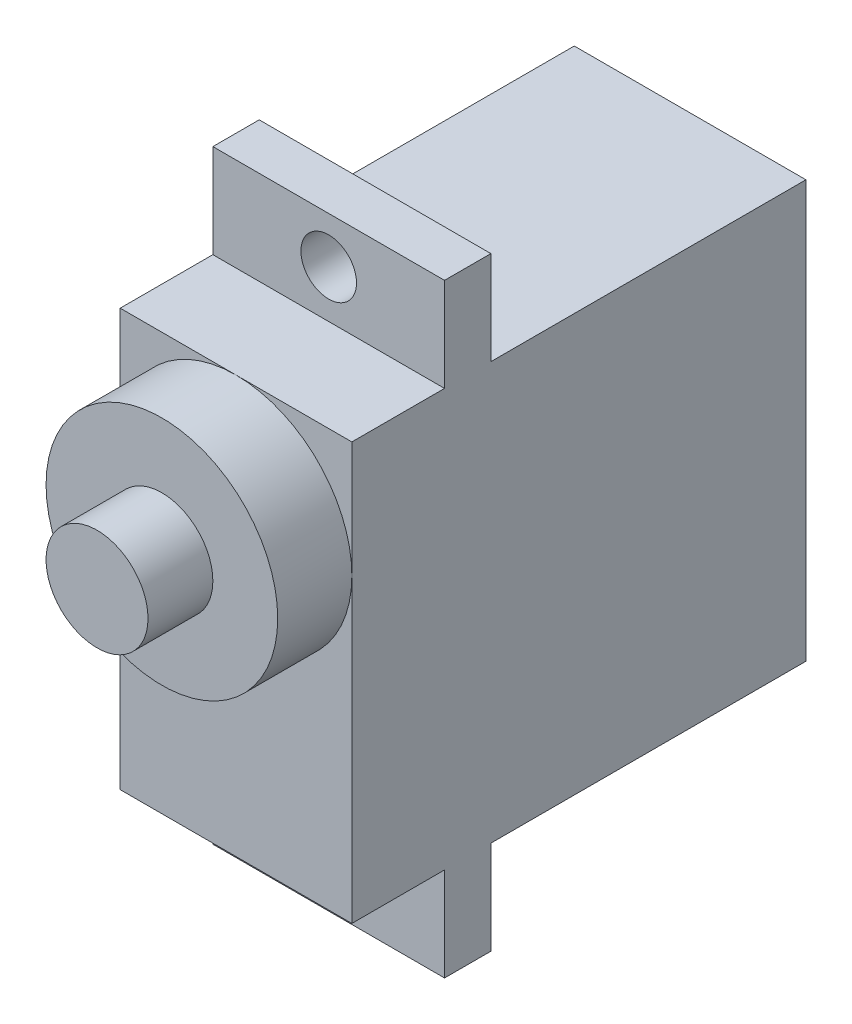
ISO-10303-21;
HEADER;
FILE_DESCRIPTION(('STEP AP214'),'2;1');
FILE_NAME('part.step','',(''),(''),'','','');
FILE_SCHEMA(('AUTOMOTIVE_DESIGN { 1 0 10303 214 1 1 1 1 }'));
ENDSEC;
DATA;
#1=APPLICATION_CONTEXT('core data for automotive mechanical design processes');
#2=APPLICATION_PROTOCOL_DEFINITION('international standard','automotive_design',2000,#1);
#3=PRODUCT_CONTEXT('',#1,'mechanical');
#4=PRODUCT('Part','Part','',(#3));
#5=PRODUCT_RELATED_PRODUCT_CATEGORY('part','',(#4));
#6=PRODUCT_DEFINITION_FORMATION('','',#4);
#7=PRODUCT_DEFINITION_CONTEXT('part definition',#1,'design');
#8=PRODUCT_DEFINITION('design','',#6,#7);
#9=PRODUCT_DEFINITION_SHAPE('','',#8);
#10=(LENGTH_UNIT() NAMED_UNIT(*) SI_UNIT(.MILLI.,.METRE.));
#11=(NAMED_UNIT(*) PLANE_ANGLE_UNIT() SI_UNIT($,.RADIAN.));
#12=(NAMED_UNIT(*) SI_UNIT($,.STERADIAN.) SOLID_ANGLE_UNIT());
#13=UNCERTAINTY_MEASURE_WITH_UNIT(LENGTH_MEASURE(1.E-05),#10,'distance_accuracy_value','');
#14=(GEOMETRIC_REPRESENTATION_CONTEXT(3) GLOBAL_UNCERTAINTY_ASSIGNED_CONTEXT((#13)) GLOBAL_UNIT_ASSIGNED_CONTEXT((#10,
#11,#12)) REPRESENTATION_CONTEXT('',''));
#15=CARTESIAN_POINT('',(0.,0.,0.));
#16=DIRECTION('',(0.,0.,1.));
#17=DIRECTION('',(1.,0.,0.));
#18=AXIS2_PLACEMENT_3D('',#15,#16,#17);
#19=CARTESIAN_POINT('',(0.,0.,24.5));
#20=DIRECTION('',(0.,0.,1.));
#21=DIRECTION('',(1.,0.,0.));
#22=AXIS2_PLACEMENT_3D('',#19,#20,#21);
#23=PLANE('',#22);
#24=DIRECTION('',(0.,1.,0.));
#25=VECTOR('',#24,1.);
#26=CARTESIAN_POINT('',(6.25,0.,24.5));
#27=LINE('',#26,#25);
#28=CARTESIAN_POINT('',(6.25,-11.25,24.5));
#29=VERTEX_POINT('',#28);
#30=CARTESIAN_POINT('',(6.25,5.,24.5));
#31=VERTEX_POINT('',#30);
#32=EDGE_CURVE('E162',#29,#31,#27,.T.);
#33=ORIENTED_EDGE('',*,*,#32,.T.);
#34=CARTESIAN_POINT('',(0.,5.,24.5));
#35=DIRECTION('',(0.,0.,1.));
#36=DIRECTION('',(1.,0.,0.));
#37=AXIS2_PLACEMENT_3D('',#34,#35,#36);
#38=CIRCLE('',#37,6.25);
#39=CARTESIAN_POINT('',(-6.25,5.,24.5));
#40=VERTEX_POINT('',#39);
#41=EDGE_CURVE('E57',#31,#40,#38,.F.);
#42=ORIENTED_EDGE('',*,*,#41,.T.);
#43=DIRECTION('',(0.,1.,0.));
#44=VECTOR('',#43,1.);
#45=CARTESIAN_POINT('',(-6.25,0.,24.5));
#46=LINE('',#45,#44);
#47=CARTESIAN_POINT('',(-6.25,-11.25,24.5));
#48=VERTEX_POINT('',#47);
#49=EDGE_CURVE('E167',#48,#40,#46,.T.);
#50=ORIENTED_EDGE('',*,*,#49,.F.);
#51=DIRECTION('',(1.,0.,0.));
#52=VECTOR('',#51,1.);
#53=CARTESIAN_POINT('',(0.,-11.25,24.5));
#54=LINE('',#53,#52);
#55=EDGE_CURVE('E172',#48,#29,#54,.T.);
#56=ORIENTED_EDGE('',*,*,#55,.T.);
#57=EDGE_LOOP('',(#33,#42,#50,#56));
#58=FACE_BOUND('',#57,.T.);
#59=ADVANCED_FACE('F41',(#58),#23,.T.);
#60=CARTESIAN_POINT('',(-6.25,11.25,24.5));
#61=VERTEX_POINT('',#60);
#62=EDGE_CURVE('E155',#40,#61,#46,.T.);
#63=ORIENTED_EDGE('',*,*,#62,.F.);
#64=CARTESIAN_POINT('',(0.,11.25,24.5));
#65=VERTEX_POINT('',#64);
#66=EDGE_CURVE('E142',#40,#65,#38,.F.);
#67=ORIENTED_EDGE('',*,*,#66,.T.);
#68=DIRECTION('',(1.,0.,0.));
#69=VECTOR('',#68,1.);
#70=CARTESIAN_POINT('',(0.,11.25,24.5));
#71=LINE('',#70,#69);
#72=EDGE_CURVE('E154',#61,#65,#71,.T.);
#73=ORIENTED_EDGE('',*,*,#72,.F.);
#74=EDGE_LOOP('',(#63,#67,#73));
#75=FACE_BOUND('',#74,.T.);
#76=ADVANCED_FACE('F152',(#75),#23,.T.);
#77=CARTESIAN_POINT('',(6.25,0.,24.5));
#78=DIRECTION('',(-1.,0.,0.));
#79=DIRECTION('',(0.,0.,1.));
#80=AXIS2_PLACEMENT_3D('',#77,#78,#79);
#81=PLANE('',#80);
#82=DIRECTION('',(0.,1.,0.));
#83=VECTOR('',#82,1.);
#84=CARTESIAN_POINT('',(6.25,0.,0.));
#85=LINE('',#84,#83);
#86=CARTESIAN_POINT('',(6.25,-11.25,0.));
#87=VERTEX_POINT('',#86);
#88=CARTESIAN_POINT('',(6.25,11.25,0.));
#89=VERTEX_POINT('',#88);
#90=EDGE_CURVE('E175',#87,#89,#85,.T.);
#91=ORIENTED_EDGE('',*,*,#90,.T.);
#92=DIRECTION('',(0.,0.,-1.));
#93=VECTOR('',#92,1.);
#94=CARTESIAN_POINT('',(6.25,11.25,17.));
#95=LINE('',#94,#93);
#96=CARTESIAN_POINT('',(6.25,11.25,17.));
#97=VERTEX_POINT('',#96);
#98=EDGE_CURVE('E210',#97,#89,#95,.T.);
#99=ORIENTED_EDGE('',*,*,#98,.F.);
#100=DIRECTION('',(0.,1.,0.));
#101=VECTOR('',#100,1.);
#102=CARTESIAN_POINT('',(6.25,0.,17.));
#103=LINE('',#102,#101);
#104=CARTESIAN_POINT('',(6.25,16.3,17.));
#105=VERTEX_POINT('',#104);
#106=EDGE_CURVE('E241',#97,#105,#103,.T.);
#107=ORIENTED_EDGE('',*,*,#106,.T.);
#108=DIRECTION('',(0.,0.,-1.));
#109=VECTOR('',#108,1.);
#110=CARTESIAN_POINT('',(6.25,16.3,19.5));
#111=LINE('',#110,#109);
#112=CARTESIAN_POINT('',(6.25,16.3,19.5));
#113=VERTEX_POINT('',#112);
#114=EDGE_CURVE('E178',#113,#105,#111,.T.);
#115=ORIENTED_EDGE('',*,*,#114,.F.);
#116=DIRECTION('',(0.,1.,0.));
#117=VECTOR('',#116,1.);
#118=CARTESIAN_POINT('',(6.25,0.,19.5));
#119=LINE('',#118,#117);
#120=CARTESIAN_POINT('',(6.25,11.25,19.5));
#121=VERTEX_POINT('',#120);
#122=EDGE_CURVE('E200',#121,#113,#119,.T.);
#123=ORIENTED_EDGE('',*,*,#122,.F.);
#124=DIRECTION('',(0.,0.,-1.));
#125=VECTOR('',#124,1.);
#126=CARTESIAN_POINT('',(6.25,11.25,24.5));
#127=LINE('',#126,#125);
#128=CARTESIAN_POINT('',(6.25,11.25,24.5));
#129=VERTEX_POINT('',#128);
#130=EDGE_CURVE('E11',#129,#121,#127,.T.);
#131=ORIENTED_EDGE('',*,*,#130,.F.);
#132=EDGE_CURVE('E159',#31,#129,#27,.T.);
#133=ORIENTED_EDGE('',*,*,#132,.F.);
#134=ORIENTED_EDGE('',*,*,#32,.F.);
#135=DIRECTION('',(0.,0.,-1.));
#136=VECTOR('',#135,1.);
#137=CARTESIAN_POINT('',(6.25,-11.25,24.5));
#138=LINE('',#137,#136);
#139=CARTESIAN_POINT('',(6.25,-11.25,19.5));
#140=VERTEX_POINT('',#139);
#141=EDGE_CURVE('E174',#29,#140,#138,.T.);
#142=ORIENTED_EDGE('',*,*,#141,.T.);
#143=DIRECTION('',(0.,1.,0.));
#144=VECTOR('',#143,1.);
#145=CARTESIAN_POINT('',(6.25,0.,19.5));
#146=LINE('',#145,#144);
#147=CARTESIAN_POINT('',(6.25,-16.3,19.5));
#148=VERTEX_POINT('',#147);
#149=EDGE_CURVE('E209',#148,#140,#146,.T.);
#150=ORIENTED_EDGE('',*,*,#149,.F.);
#151=DIRECTION('',(0.,0.,-1.));
#152=VECTOR('',#151,1.);
#153=CARTESIAN_POINT('',(6.25,-16.3,19.5));
#154=LINE('',#153,#152);
#155=CARTESIAN_POINT('',(6.25,-16.3,17.));
#156=VERTEX_POINT('',#155);
#157=EDGE_CURVE('E223',#148,#156,#154,.T.);
#158=ORIENTED_EDGE('',*,*,#157,.T.);
#159=DIRECTION('',(0.,1.,0.));
#160=VECTOR('',#159,1.);
#161=CARTESIAN_POINT('',(6.25,0.,17.));
#162=LINE('',#161,#160);
#163=CARTESIAN_POINT('',(6.25,-11.25,17.));
#164=VERTEX_POINT('',#163);
#165=EDGE_CURVE('E65',#156,#164,#162,.T.);
#166=ORIENTED_EDGE('',*,*,#165,.T.);
#167=DIRECTION('',(0.,0.,-1.));
#168=VECTOR('',#167,1.);
#169=CARTESIAN_POINT('',(6.25,-11.25,17.));
#170=LINE('',#169,#168);
#171=EDGE_CURVE('E234',#164,#87,#170,.T.);
#172=ORIENTED_EDGE('',*,*,#171,.T.);
#173=EDGE_LOOP('',(#91,#99,#107,#115,#123,#131,#133,#134,#142,#150,#158,#166,#172));
#174=FACE_BOUND('',#173,.T.);
#175=ADVANCED_FACE('F43',(#174),#81,.F.);
#176=CARTESIAN_POINT('',(-6.25,0.,24.5));
#177=DIRECTION('',(-1.,0.,0.));
#178=DIRECTION('',(0.,0.,1.));
#179=AXIS2_PLACEMENT_3D('',#176,#177,#178);
#180=PLANE('',#179);
#181=ORIENTED_EDGE('',*,*,#49,.T.);
#182=ORIENTED_EDGE('',*,*,#62,.T.);
#183=DIRECTION('',(0.,0.,-1.));
#184=VECTOR('',#183,1.);
#185=CARTESIAN_POINT('',(-6.25,11.25,24.5));
#186=LINE('',#185,#184);
#187=CARTESIAN_POINT('',(-6.25,11.25,19.5));
#188=VERTEX_POINT('',#187);
#189=EDGE_CURVE('E50',#61,#188,#186,.T.);
#190=ORIENTED_EDGE('',*,*,#189,.T.);
#191=DIRECTION('',(0.,1.,0.));
#192=VECTOR('',#191,1.);
#193=CARTESIAN_POINT('',(-6.25,0.,19.5));
#194=LINE('',#193,#192);
#195=CARTESIAN_POINT('',(-6.25,16.3,19.5));
#196=VERTEX_POINT('',#195);
#197=EDGE_CURVE('E190',#188,#196,#194,.T.);
#198=ORIENTED_EDGE('',*,*,#197,.T.);
#199=DIRECTION('',(0.,0.,-1.));
#200=VECTOR('',#199,1.);
#201=CARTESIAN_POINT('',(-6.25,16.3,19.5));
#202=LINE('',#201,#200);
#203=CARTESIAN_POINT('',(-6.25,16.3,17.));
#204=VERTEX_POINT('',#203);
#205=EDGE_CURVE('E197',#196,#204,#202,.T.);
#206=ORIENTED_EDGE('',*,*,#205,.T.);
#207=DIRECTION('',(0.,1.,0.));
#208=VECTOR('',#207,1.);
#209=CARTESIAN_POINT('',(-6.25,0.,17.));
#210=LINE('',#209,#208);
#211=CARTESIAN_POINT('',(-6.25,11.25,17.));
#212=VERTEX_POINT('',#211);
#213=EDGE_CURVE('E248',#212,#204,#210,.T.);
#214=ORIENTED_EDGE('',*,*,#213,.F.);
#215=DIRECTION('',(0.,0.,-1.));
#216=VECTOR('',#215,1.);
#217=CARTESIAN_POINT('',(-6.25,11.25,17.));
#218=LINE('',#217,#216);
#219=CARTESIAN_POINT('',(-6.25,11.25,0.));
#220=VERTEX_POINT('',#219);
#221=EDGE_CURVE('E250',#212,#220,#218,.T.);
#222=ORIENTED_EDGE('',*,*,#221,.T.);
#223=DIRECTION('',(0.,1.,0.));
#224=VECTOR('',#223,1.);
#225=CARTESIAN_POINT('',(-6.25,0.,0.));
#226=LINE('',#225,#224);
#227=CARTESIAN_POINT('',(-6.25,-11.25,0.));
#228=VERTEX_POINT('',#227);
#229=EDGE_CURVE('E177',#228,#220,#226,.T.);
#230=ORIENTED_EDGE('',*,*,#229,.F.);
#231=DIRECTION('',(0.,0.,-1.));
#232=VECTOR('',#231,1.);
#233=CARTESIAN_POINT('',(-6.25,-11.25,17.));
#234=LINE('',#233,#232);
#235=CARTESIAN_POINT('',(-6.25,-11.25,17.));
#236=VERTEX_POINT('',#235);
#237=EDGE_CURVE('E276',#236,#228,#234,.T.);
#238=ORIENTED_EDGE('',*,*,#237,.F.);
#239=DIRECTION('',(0.,1.,0.));
#240=VECTOR('',#239,1.);
#241=CARTESIAN_POINT('',(-6.25,0.,17.));
#242=LINE('',#241,#240);
#243=CARTESIAN_POINT('',(-6.25,-16.3,17.));
#244=VERTEX_POINT('',#243);
#245=EDGE_CURVE('E270',#244,#236,#242,.T.);
#246=ORIENTED_EDGE('',*,*,#245,.F.);
#247=DIRECTION('',(0.,0.,-1.));
#248=VECTOR('',#247,1.);
#249=CARTESIAN_POINT('',(-6.25,-16.3,19.5));
#250=LINE('',#249,#248);
#251=CARTESIAN_POINT('',(-6.25,-16.3,19.5));
#252=VERTEX_POINT('',#251);
#253=EDGE_CURVE('E221',#252,#244,#250,.T.);
#254=ORIENTED_EDGE('',*,*,#253,.F.);
#255=DIRECTION('',(0.,1.,0.));
#256=VECTOR('',#255,1.);
#257=CARTESIAN_POINT('',(-6.25,0.,19.5));
#258=LINE('',#257,#256);
#259=CARTESIAN_POINT('',(-6.25,-11.25,19.5));
#260=VERTEX_POINT('',#259);
#261=EDGE_CURVE('E215',#252,#260,#258,.T.);
#262=ORIENTED_EDGE('',*,*,#261,.T.);
#263=DIRECTION('',(0.,0.,-1.));
#264=VECTOR('',#263,1.);
#265=CARTESIAN_POINT('',(-6.25,-11.25,24.5));
#266=LINE('',#265,#264);
#267=EDGE_CURVE('E182',#48,#260,#266,.T.);
#268=ORIENTED_EDGE('',*,*,#267,.F.);
#269=EDGE_LOOP('',(#181,#182,#190,#198,#206,#214,#222,#230,#238,#246,#254,#262,#268));
#270=FACE_BOUND('',#269,.T.);
#271=ADVANCED_FACE('F188',(#270),#180,.T.);
#272=CARTESIAN_POINT('',(0.,0.,0.));
#273=DIRECTION('',(0.,0.,1.));
#274=DIRECTION('',(1.,0.,0.));
#275=AXIS2_PLACEMENT_3D('',#272,#273,#274);
#276=PLANE('',#275);
#277=DIRECTION('',(1.,0.,0.));
#278=VECTOR('',#277,1.);
#279=CARTESIAN_POINT('',(0.,11.25,0.));
#280=LINE('',#279,#278);
#281=EDGE_CURVE('E258',#220,#89,#280,.T.);
#282=ORIENTED_EDGE('',*,*,#281,.T.);
#283=ORIENTED_EDGE('',*,*,#90,.F.);
#284=DIRECTION('',(1.,0.,0.));
#285=VECTOR('',#284,1.);
#286=CARTESIAN_POINT('',(0.,-11.25,0.));
#287=LINE('',#286,#285);
#288=EDGE_CURVE('E266',#228,#87,#287,.T.);
#289=ORIENTED_EDGE('',*,*,#288,.F.);
#290=ORIENTED_EDGE('',*,*,#229,.T.);
#291=EDGE_LOOP('',(#282,#283,#289,#290));
#292=FACE_BOUND('',#291,.T.);
#293=ADVANCED_FACE('F283',(#292),#276,.F.);
#294=CARTESIAN_POINT('',(0.,11.25,24.5));
#295=DIRECTION('',(0.,1.,0.));
#296=DIRECTION('',(0.,0.,1.));
#297=AXIS2_PLACEMENT_3D('',#294,#295,#296);
#298=PLANE('',#297);
#299=ORIENTED_EDGE('',*,*,#72,.T.);
#300=EDGE_CURVE('E157',#65,#129,#71,.T.);
#301=ORIENTED_EDGE('',*,*,#300,.T.);
#302=ORIENTED_EDGE('',*,*,#130,.T.);
#303=DIRECTION('',(1.,0.,0.));
#304=VECTOR('',#303,1.);
#305=CARTESIAN_POINT('',(0.,11.25,19.5));
#306=LINE('',#305,#304);
#307=EDGE_CURVE('E194',#188,#121,#306,.T.);
#308=ORIENTED_EDGE('',*,*,#307,.F.);
#309=ORIENTED_EDGE('',*,*,#189,.F.);
#310=EDGE_LOOP('',(#299,#301,#302,#308,#309));
#311=FACE_BOUND('',#310,.T.);
#312=ADVANCED_FACE('F165',(#311),#298,.T.);
#313=CARTESIAN_POINT('',(0.,-11.25,24.5));
#314=DIRECTION('',(0.,1.,0.));
#315=DIRECTION('',(0.,0.,1.));
#316=AXIS2_PLACEMENT_3D('',#313,#314,#315);
#317=PLANE('',#316);
#318=ORIENTED_EDGE('',*,*,#267,.T.);
#319=DIRECTION('',(1.,0.,0.));
#320=VECTOR('',#319,1.);
#321=CARTESIAN_POINT('',(0.,-11.25,19.5));
#322=LINE('',#321,#320);
#323=EDGE_CURVE('E212',#260,#140,#322,.T.);
#324=ORIENTED_EDGE('',*,*,#323,.T.);
#325=ORIENTED_EDGE('',*,*,#141,.F.);
#326=ORIENTED_EDGE('',*,*,#55,.F.);
#327=EDGE_LOOP('',(#318,#324,#325,#326));
#328=FACE_BOUND('',#327,.T.);
#329=ADVANCED_FACE('F328',(#328),#317,.F.);
#330=ORIENTED_EDGE('',*,*,#300,.F.);
#331=EDGE_CURVE('E138',#65,#31,#38,.F.);
#332=ORIENTED_EDGE('',*,*,#331,.T.);
#333=ORIENTED_EDGE('',*,*,#132,.T.);
#334=EDGE_LOOP('',(#330,#332,#333));
#335=FACE_BOUND('',#334,.T.);
#336=ADVANCED_FACE('F158',(#335),#23,.T.);
#337=CARTESIAN_POINT('',(0.,-16.3,19.5));
#338=DIRECTION('',(0.,1.,0.));
#339=DIRECTION('',(0.,0.,1.));
#340=AXIS2_PLACEMENT_3D('',#337,#338,#339);
#341=PLANE('',#340);
#342=ORIENTED_EDGE('',*,*,#253,.T.);
#343=DIRECTION('',(1.,0.,0.));
#344=VECTOR('',#343,1.);
#345=CARTESIAN_POINT('',(0.,-16.3,17.));
#346=LINE('',#345,#344);
#347=EDGE_CURVE('E264',#244,#156,#346,.T.);
#348=ORIENTED_EDGE('',*,*,#347,.T.);
#349=ORIENTED_EDGE('',*,*,#157,.F.);
#350=DIRECTION('',(1.,0.,0.));
#351=VECTOR('',#350,1.);
#352=CARTESIAN_POINT('',(0.,-16.3,19.5));
#353=LINE('',#352,#351);
#354=EDGE_CURVE('E206',#252,#148,#353,.T.);
#355=ORIENTED_EDGE('',*,*,#354,.F.);
#356=EDGE_LOOP('',(#342,#348,#349,#355));
#357=FACE_BOUND('',#356,.T.);
#358=ADVANCED_FACE('F327',(#357),#341,.F.);
#359=CARTESIAN_POINT('',(0.,-13.8,19.5));
#360=DIRECTION('',(0.,0.,-1.));
#361=DIRECTION('',(-1.,0.,0.));
#362=AXIS2_PLACEMENT_3D('',#359,#360,#361);
#363=CYLINDRICAL_SURFACE('',#362,1.5);
#364=CARTESIAN_POINT('',(0.,-13.8,17.));
#365=DIRECTION('',(0.,0.,1.));
#366=DIRECTION('',(1.,0.,0.));
#367=AXIS2_PLACEMENT_3D('',#364,#365,#366);
#368=CIRCLE('',#367,1.5);
#369=CARTESIAN_POINT('',(1.5,-13.8,17.));
#370=VERTEX_POINT('',#369);
#371=EDGE_CURVE('E273',#370,#370,#368,.F.);
#372=ORIENTED_EDGE('',*,*,#371,.T.);
#373=EDGE_LOOP('',(#372));
#374=FACE_BOUND('',#373,.T.);
#375=CARTESIAN_POINT('',(0.,-13.8,19.5));
#376=DIRECTION('',(0.,0.,1.));
#377=DIRECTION('',(1.,0.,0.));
#378=AXIS2_PLACEMENT_3D('',#375,#376,#377);
#379=CIRCLE('',#378,1.5);
#380=CARTESIAN_POINT('',(1.5,-13.8,19.5));
#381=VERTEX_POINT('',#380);
#382=EDGE_CURVE('E218',#381,#381,#379,.F.);
#383=ORIENTED_EDGE('',*,*,#382,.F.);
#384=EDGE_LOOP('',(#383));
#385=FACE_BOUND('',#384,.T.);
#386=ADVANCED_FACE('F334',(#374,#385),#363,.F.);
#387=CARTESIAN_POINT('',(0.,0.,19.5));
#388=DIRECTION('',(0.,0.,1.));
#389=DIRECTION('',(1.,0.,0.));
#390=AXIS2_PLACEMENT_3D('',#387,#388,#389);
#391=PLANE('',#390);
#392=ORIENTED_EDGE('',*,*,#354,.T.);
#393=ORIENTED_EDGE('',*,*,#149,.T.);
#394=ORIENTED_EDGE('',*,*,#323,.F.);
#395=ORIENTED_EDGE('',*,*,#261,.F.);
#396=EDGE_LOOP('',(#392,#393,#394,#395));
#397=FACE_BOUND('',#396,.T.);
#398=ORIENTED_EDGE('',*,*,#382,.T.);
#399=EDGE_LOOP('',(#398));
#400=FACE_BOUND('',#399,.T.);
#401=ADVANCED_FACE('F478',(#397,#400),#391,.T.);
#402=CARTESIAN_POINT('',(0.,16.3,19.5));
#403=DIRECTION('',(0.,1.,0.));
#404=DIRECTION('',(0.,0.,1.));
#405=AXIS2_PLACEMENT_3D('',#402,#403,#404);
#406=PLANE('',#405);
#407=DIRECTION('',(1.,0.,0.));
#408=VECTOR('',#407,1.);
#409=CARTESIAN_POINT('',(0.,16.3,17.));
#410=LINE('',#409,#408);
#411=EDGE_CURVE('E245',#204,#105,#410,.T.);
#412=ORIENTED_EDGE('',*,*,#411,.F.);
#413=ORIENTED_EDGE('',*,*,#205,.F.);
#414=DIRECTION('',(1.,0.,0.));
#415=VECTOR('',#414,1.);
#416=CARTESIAN_POINT('',(0.,16.3,19.5));
#417=LINE('',#416,#415);
#418=EDGE_CURVE('E196',#196,#113,#417,.T.);
#419=ORIENTED_EDGE('',*,*,#418,.T.);
#420=ORIENTED_EDGE('',*,*,#114,.T.);
#421=EDGE_LOOP('',(#412,#413,#419,#420));
#422=FACE_BOUND('',#421,.T.);
#423=ADVANCED_FACE('F244',(#422),#406,.T.);
#424=CARTESIAN_POINT('',(0.,13.8,19.5));
#425=DIRECTION('',(0.,0.,-1.));
#426=DIRECTION('',(-1.,0.,0.));
#427=AXIS2_PLACEMENT_3D('',#424,#425,#426);
#428=CYLINDRICAL_SURFACE('',#427,1.5);
#429=CARTESIAN_POINT('',(0.,13.8,17.));
#430=DIRECTION('',(0.,0.,1.));
#431=DIRECTION('',(1.,0.,0.));
#432=AXIS2_PLACEMENT_3D('',#429,#430,#431);
#433=CIRCLE('',#432,1.5);
#434=CARTESIAN_POINT('',(1.5,13.8,17.));
#435=VERTEX_POINT('',#434);
#436=EDGE_CURVE('E260',#435,#435,#433,.T.);
#437=ORIENTED_EDGE('',*,*,#436,.F.);
#438=EDGE_LOOP('',(#437));
#439=FACE_BOUND('',#438,.T.);
#440=CARTESIAN_POINT('',(0.,13.8,19.5));
#441=DIRECTION('',(0.,0.,1.));
#442=DIRECTION('',(1.,0.,0.));
#443=AXIS2_PLACEMENT_3D('',#440,#441,#442);
#444=CIRCLE('',#443,1.5);
#445=CARTESIAN_POINT('',(1.5,13.8,19.5));
#446=VERTEX_POINT('',#445);
#447=EDGE_CURVE('E225',#446,#446,#444,.T.);
#448=ORIENTED_EDGE('',*,*,#447,.T.);
#449=EDGE_LOOP('',(#448));
#450=FACE_BOUND('',#449,.T.);
#451=ADVANCED_FACE('F418',(#439,#450),#428,.F.);
#452=CARTESIAN_POINT('',(0.,0.,19.5));
#453=DIRECTION('',(0.,0.,1.));
#454=DIRECTION('',(1.,0.,0.));
#455=AXIS2_PLACEMENT_3D('',#452,#453,#454);
#456=PLANE('',#455);
#457=ORIENTED_EDGE('',*,*,#447,.F.);
#458=EDGE_LOOP('',(#457));
#459=FACE_BOUND('',#458,.T.);
#460=ORIENTED_EDGE('',*,*,#307,.T.);
#461=ORIENTED_EDGE('',*,*,#122,.T.);
#462=ORIENTED_EDGE('',*,*,#418,.F.);
#463=ORIENTED_EDGE('',*,*,#197,.F.);
#464=EDGE_LOOP('',(#460,#461,#462,#463));
#465=FACE_BOUND('',#464,.T.);
#466=ADVANCED_FACE('F193',(#459,#465),#456,.T.);
#467=CARTESIAN_POINT('',(0.,11.25,17.));
#468=DIRECTION('',(0.,1.,0.));
#469=DIRECTION('',(0.,0.,1.));
#470=AXIS2_PLACEMENT_3D('',#467,#468,#469);
#471=PLANE('',#470);
#472=DIRECTION('',(1.,0.,0.));
#473=VECTOR('',#472,1.);
#474=CARTESIAN_POINT('',(0.,11.25,17.));
#475=LINE('',#474,#473);
#476=EDGE_CURVE('E287',#212,#97,#475,.T.);
#477=ORIENTED_EDGE('',*,*,#476,.T.);
#478=ORIENTED_EDGE('',*,*,#98,.T.);
#479=ORIENTED_EDGE('',*,*,#281,.F.);
#480=ORIENTED_EDGE('',*,*,#221,.F.);
#481=EDGE_LOOP('',(#477,#478,#479,#480));
#482=FACE_BOUND('',#481,.T.);
#483=ADVANCED_FACE('F286',(#482),#471,.T.);
#484=CARTESIAN_POINT('',(0.,0.,17.));
#485=DIRECTION('',(0.,0.,1.));
#486=DIRECTION('',(1.,0.,0.));
#487=AXIS2_PLACEMENT_3D('',#484,#485,#486);
#488=PLANE('',#487);
#489=ORIENTED_EDGE('',*,*,#436,.T.);
#490=EDGE_LOOP('',(#489));
#491=FACE_BOUND('',#490,.T.);
#492=ORIENTED_EDGE('',*,*,#476,.F.);
#493=ORIENTED_EDGE('',*,*,#213,.T.);
#494=ORIENTED_EDGE('',*,*,#411,.T.);
#495=ORIENTED_EDGE('',*,*,#106,.F.);
#496=EDGE_LOOP('',(#492,#493,#494,#495));
#497=FACE_BOUND('',#496,.T.);
#498=ADVANCED_FACE('F289',(#491,#497),#488,.F.);
#499=CARTESIAN_POINT('',(0.,-11.25,17.));
#500=DIRECTION('',(0.,1.,0.));
#501=DIRECTION('',(0.,0.,1.));
#502=AXIS2_PLACEMENT_3D('',#499,#500,#501);
#503=PLANE('',#502);
#504=ORIENTED_EDGE('',*,*,#288,.T.);
#505=ORIENTED_EDGE('',*,*,#171,.F.);
#506=DIRECTION('',(1.,0.,0.));
#507=VECTOR('',#506,1.);
#508=CARTESIAN_POINT('',(0.,-11.25,17.));
#509=LINE('',#508,#507);
#510=EDGE_CURVE('E268',#236,#164,#509,.T.);
#511=ORIENTED_EDGE('',*,*,#510,.F.);
#512=ORIENTED_EDGE('',*,*,#237,.T.);
#513=EDGE_LOOP('',(#504,#505,#511,#512));
#514=FACE_BOUND('',#513,.T.);
#515=ADVANCED_FACE('F404',(#514),#503,.F.);
#516=CARTESIAN_POINT('',(0.,0.,17.));
#517=DIRECTION('',(0.,0.,1.));
#518=DIRECTION('',(1.,0.,0.));
#519=AXIS2_PLACEMENT_3D('',#516,#517,#518);
#520=PLANE('',#519);
#521=ORIENTED_EDGE('',*,*,#347,.F.);
#522=ORIENTED_EDGE('',*,*,#245,.T.);
#523=ORIENTED_EDGE('',*,*,#510,.T.);
#524=ORIENTED_EDGE('',*,*,#165,.F.);
#525=EDGE_LOOP('',(#521,#522,#523,#524));
#526=FACE_BOUND('',#525,.T.);
#527=ORIENTED_EDGE('',*,*,#371,.F.);
#528=EDGE_LOOP('',(#527));
#529=FACE_BOUND('',#528,.T.);
#530=ADVANCED_FACE('F363',(#526,#529),#520,.F.);
#531=CARTESIAN_POINT('',(0.,5.,28.5));
#532=DIRECTION('',(0.,0.,-1.));
#533=DIRECTION('',(-1.,0.,0.));
#534=AXIS2_PLACEMENT_3D('',#531,#532,#533);
#535=CYLINDRICAL_SURFACE('',#534,6.25);
#536=ORIENTED_EDGE('',*,*,#41,.F.);
#537=ORIENTED_EDGE('',*,*,#331,.F.);
#538=ORIENTED_EDGE('',*,*,#66,.F.);
#539=EDGE_LOOP('',(#536,#537,#538));
#540=FACE_BOUND('',#539,.T.);
#541=CARTESIAN_POINT('',(0.,5.,28.5));
#542=DIRECTION('',(0.,0.,1.));
#543=DIRECTION('',(1.,0.,0.));
#544=AXIS2_PLACEMENT_3D('',#541,#542,#543);
#545=CIRCLE('',#544,6.25);
#546=CARTESIAN_POINT('',(6.25,5.,28.5));
#547=VERTEX_POINT('',#546);
#548=EDGE_CURVE('E147',#547,#547,#545,.T.);
#549=ORIENTED_EDGE('',*,*,#548,.F.);
#550=EDGE_LOOP('',(#549));
#551=FACE_BOUND('',#550,.T.);
#552=ADVANCED_FACE('F140',(#540,#551),#535,.T.);
#553=CARTESIAN_POINT('',(0.,0.,28.5));
#554=DIRECTION('',(0.,0.,1.));
#555=DIRECTION('',(1.,0.,0.));
#556=AXIS2_PLACEMENT_3D('',#553,#554,#555);
#557=PLANE('',#556);
#558=CARTESIAN_POINT('',(0.,5.,28.5));
#559=DIRECTION('',(0.,0.,1.));
#560=DIRECTION('',(1.,0.,0.));
#561=AXIS2_PLACEMENT_3D('',#558,#559,#560);
#562=CIRCLE('',#561,2.75);
#563=CARTESIAN_POINT('',(2.75,5.,28.5));
#564=VERTEX_POINT('',#563);
#565=EDGE_CURVE('E45',#564,#564,#562,.F.);
#566=ORIENTED_EDGE('',*,*,#565,.T.);
#567=EDGE_LOOP('',(#566));
#568=FACE_BOUND('',#567,.T.);
#569=ORIENTED_EDGE('',*,*,#548,.T.);
#570=EDGE_LOOP('',(#569));
#571=FACE_BOUND('',#570,.T.);
#572=ADVANCED_FACE('F302',(#568,#571),#557,.T.);
#573=CARTESIAN_POINT('',(0.,5.,32.));
#574=DIRECTION('',(0.,0.,-1.));
#575=DIRECTION('',(-1.,0.,0.));
#576=AXIS2_PLACEMENT_3D('',#573,#574,#575);
#577=CYLINDRICAL_SURFACE('',#576,2.75);
#578=ORIENTED_EDGE('',*,*,#565,.F.);
#579=EDGE_LOOP('',(#578));
#580=FACE_BOUND('',#579,.T.);
#581=CARTESIAN_POINT('',(0.,5.,32.));
#582=DIRECTION('',(0.,0.,1.));
#583=DIRECTION('',(1.,0.,0.));
#584=AXIS2_PLACEMENT_3D('',#581,#582,#583);
#585=CIRCLE('',#584,2.75);
#586=CARTESIAN_POINT('',(2.75,5.,32.));
#587=VERTEX_POINT('',#586);
#588=EDGE_CURVE('E295',#587,#587,#585,.T.);
#589=ORIENTED_EDGE('',*,*,#588,.F.);
#590=EDGE_LOOP('',(#589));
#591=FACE_BOUND('',#590,.T.);
#592=ADVANCED_FACE('F305',(#580,#591),#577,.T.);
#593=CARTESIAN_POINT('',(0.,0.,32.));
#594=DIRECTION('',(0.,0.,1.));
#595=DIRECTION('',(1.,0.,0.));
#596=AXIS2_PLACEMENT_3D('',#593,#594,#595);
#597=PLANE('',#596);
#598=ORIENTED_EDGE('',*,*,#588,.T.);
#599=EDGE_LOOP('',(#598));
#600=FACE_BOUND('',#599,.T.);
#601=ADVANCED_FACE('F308',(#600),#597,.T.);
#602=CLOSED_SHELL('',(#59,#76,#175,#271,#293,#312,#329,#336,#358,#386,#401,#423,#451,#466,#483,
#498,#515,#530,#552,#572,#592,#601));
#603=MANIFOLD_SOLID_BREP('B2',#602);
#604=ADVANCED_BREP_SHAPE_REPRESENTATION('',(#18,#603),#14);
#605=SHAPE_DEFINITION_REPRESENTATION(#9,#604);
ENDSEC;
END-ISO-10303-21;
